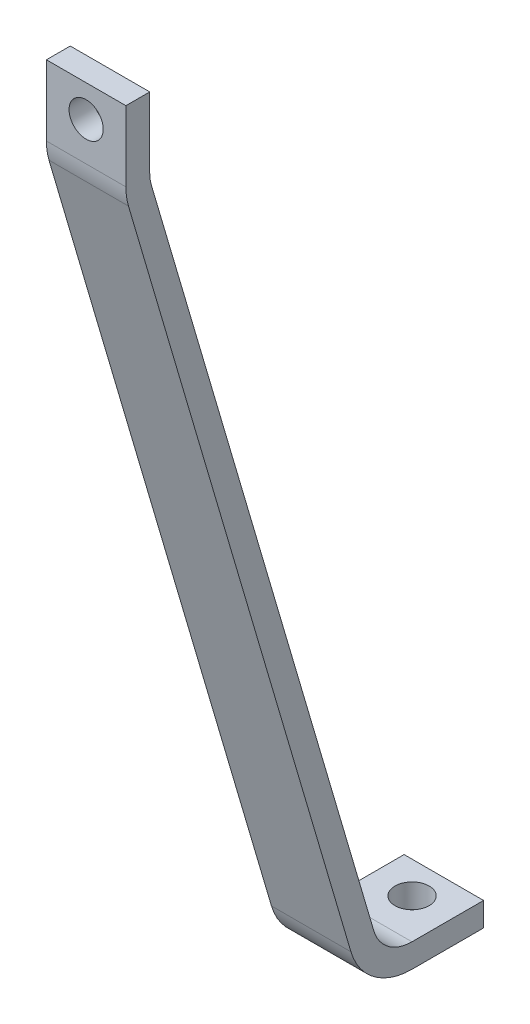
ISO-10303-21;
HEADER;
FILE_DESCRIPTION(('STEP AP214'),'2;1');
FILE_NAME('part.step','',(''),(''),'','','');
FILE_SCHEMA(('AUTOMOTIVE_DESIGN { 1 0 10303 214 1 1 1 1 }'));
ENDSEC;
DATA;
#1=APPLICATION_CONTEXT('core data for automotive mechanical design processes');
#2=APPLICATION_PROTOCOL_DEFINITION('international standard','automotive_design',2000,#1);
#3=PRODUCT_CONTEXT('',#1,'mechanical');
#4=PRODUCT('Part','Part','',(#3));
#5=PRODUCT_RELATED_PRODUCT_CATEGORY('part','',(#4));
#6=PRODUCT_DEFINITION_FORMATION('','',#4);
#7=PRODUCT_DEFINITION_CONTEXT('part definition',#1,'design');
#8=PRODUCT_DEFINITION('design','',#6,#7);
#9=PRODUCT_DEFINITION_SHAPE('','',#8);
#10=(LENGTH_UNIT() NAMED_UNIT(*) SI_UNIT(.MILLI.,.METRE.));
#11=(NAMED_UNIT(*) PLANE_ANGLE_UNIT() SI_UNIT($,.RADIAN.));
#12=(NAMED_UNIT(*) SI_UNIT($,.STERADIAN.) SOLID_ANGLE_UNIT());
#13=UNCERTAINTY_MEASURE_WITH_UNIT(LENGTH_MEASURE(1.E-05),#10,'distance_accuracy_value','');
#14=(GEOMETRIC_REPRESENTATION_CONTEXT(3) GLOBAL_UNCERTAINTY_ASSIGNED_CONTEXT((#13)) GLOBAL_UNIT_ASSIGNED_CONTEXT((#10,
#11,#12)) REPRESENTATION_CONTEXT('',''));
#15=CARTESIAN_POINT('',(0.,0.,0.));
#16=DIRECTION('',(0.,0.,1.));
#17=DIRECTION('',(1.,0.,0.));
#18=AXIS2_PLACEMENT_3D('',#15,#16,#17);
#19=CARTESIAN_POINT('',(5.,0.,-35.9873928342079));
#20=DIRECTION('',(0.,1.,0.));
#21=DIRECTION('',(0.,0.,1.));
#22=AXIS2_PLACEMENT_3D('',#19,#20,#21);
#23=PLANE('',#22);
#24=CARTESIAN_POINT('',(0.,0.,-41.));
#25=DIRECTION('',(0.,-1.,0.));
#26=DIRECTION('',(0.,0.,-1.));
#27=AXIS2_PLACEMENT_3D('',#24,#25,#26);
#28=CIRCLE('',#27,2.14999999999999);
#29=CARTESIAN_POINT('',(0.,0.,-43.15));
#30=VERTEX_POINT('',#29);
#31=EDGE_CURVE('E315',#30,#30,#28,.T.);
#32=ORIENTED_EDGE('',*,*,#31,.F.);
#33=EDGE_LOOP('',(#32));
#34=FACE_BOUND('',#33,.T.);
#35=DIRECTION('',(0.,0.,-1.));
#36=VECTOR('',#35,1.);
#37=CARTESIAN_POINT('',(-5.,0.,-35.9873928342079));
#38=LINE('',#37,#36);
#39=CARTESIAN_POINT('',(-5.,0.,-35.9873928342079));
#40=VERTEX_POINT('',#39);
#41=CARTESIAN_POINT('',(-5.,0.,-45.));
#42=VERTEX_POINT('',#41);
#43=EDGE_CURVE('E188',#40,#42,#38,.T.);
#44=ORIENTED_EDGE('',*,*,#43,.T.);
#45=DIRECTION('',(-1.,0.,0.));
#46=VECTOR('',#45,1.);
#47=CARTESIAN_POINT('',(5.,0.,-45.));
#48=LINE('',#47,#46);
#49=CARTESIAN_POINT('',(5.,0.,-45.));
#50=VERTEX_POINT('',#49);
#51=EDGE_CURVE('E11',#50,#42,#48,.T.);
#52=ORIENTED_EDGE('',*,*,#51,.F.);
#53=DIRECTION('',(0.,0.,-1.));
#54=VECTOR('',#53,1.);
#55=CARTESIAN_POINT('',(5.,0.,-35.9873928342079));
#56=LINE('',#55,#54);
#57=CARTESIAN_POINT('',(5.,0.,-35.9873928342079));
#58=VERTEX_POINT('',#57);
#59=EDGE_CURVE('E123',#58,#50,#56,.T.);
#60=ORIENTED_EDGE('',*,*,#59,.F.);
#61=DIRECTION('',(-1.,0.,0.));
#62=VECTOR('',#61,1.);
#63=CARTESIAN_POINT('',(5.,0.,-35.9873928342079));
#64=LINE('',#63,#62);
#65=EDGE_CURVE('E184',#58,#40,#64,.T.);
#66=ORIENTED_EDGE('',*,*,#65,.T.);
#67=EDGE_LOOP('',(#44,#52,#60,#66));
#68=FACE_BOUND('',#67,.T.);
#69=ADVANCED_FACE('F40',(#34,#68),#23,.F.);
#70=CARTESIAN_POINT('',(5.,3.,-45.));
#71=DIRECTION('',(0.,0.,-1.));
#72=DIRECTION('',(-1.,0.,0.));
#73=AXIS2_PLACEMENT_3D('',#70,#71,#72);
#74=PLANE('',#73);
#75=DIRECTION('',(0.,-1.,0.));
#76=VECTOR('',#75,1.);
#77=CARTESIAN_POINT('',(-5.,2.99999999999999,-45.));
#78=LINE('',#77,#76);
#79=CARTESIAN_POINT('',(-5.,2.99999999999999,-45.));
#80=VERTEX_POINT('',#79);
#81=EDGE_CURVE('E192',#80,#42,#78,.T.);
#82=ORIENTED_EDGE('',*,*,#81,.F.);
#83=DIRECTION('',(-1.,0.,0.));
#84=VECTOR('',#83,1.);
#85=CARTESIAN_POINT('',(5.,3.,-45.));
#86=LINE('',#85,#84);
#87=CARTESIAN_POINT('',(5.,3.,-45.));
#88=VERTEX_POINT('',#87);
#89=EDGE_CURVE('E49',#88,#80,#86,.T.);
#90=ORIENTED_EDGE('',*,*,#89,.F.);
#91=DIRECTION('',(0.,-1.,0.));
#92=VECTOR('',#91,1.);
#93=CARTESIAN_POINT('',(5.,3.,-45.));
#94=LINE('',#93,#92);
#95=EDGE_CURVE('E276',#88,#50,#94,.T.);
#96=ORIENTED_EDGE('',*,*,#95,.T.);
#97=ORIENTED_EDGE('',*,*,#51,.T.);
#98=EDGE_LOOP('',(#82,#90,#96,#97));
#99=FACE_BOUND('',#98,.T.);
#100=ADVANCED_FACE('F263',(#99),#74,.T.);
#101=CARTESIAN_POINT('',(5.,2.99999999999999,-35.9873928342079));
#102=DIRECTION('',(0.,1.,0.));
#103=DIRECTION('',(0.,0.,1.));
#104=AXIS2_PLACEMENT_3D('',#101,#102,#103);
#105=PLANE('',#104);
#106=CARTESIAN_POINT('',(0.,3.,-41.));
#107=DIRECTION('',(0.,1.,0.));
#108=DIRECTION('',(0.,0.,1.));
#109=AXIS2_PLACEMENT_3D('',#106,#107,#108);
#110=CIRCLE('',#109,2.14999999999999);
#111=CARTESIAN_POINT('',(0.,3.,-38.85));
#112=VERTEX_POINT('',#111);
#113=EDGE_CURVE('E303',#112,#112,#110,.T.);
#114=ORIENTED_EDGE('',*,*,#113,.F.);
#115=EDGE_LOOP('',(#114));
#116=FACE_BOUND('',#115,.T.);
#117=DIRECTION('',(0.,0.,-1.));
#118=VECTOR('',#117,1.);
#119=CARTESIAN_POINT('',(-5.,2.99999999999999,-35.9873928342079));
#120=LINE('',#119,#118);
#121=CARTESIAN_POINT('',(-5.,2.99999999999999,-35.9873928342079));
#122=VERTEX_POINT('',#121);
#123=EDGE_CURVE('E197',#122,#80,#120,.T.);
#124=ORIENTED_EDGE('',*,*,#123,.F.);
#125=DIRECTION('',(-1.,0.,0.));
#126=VECTOR('',#125,1.);
#127=CARTESIAN_POINT('',(5.,2.99999999999999,-35.9873928342079));
#128=LINE('',#127,#126);
#129=CARTESIAN_POINT('',(5.,2.99999999999999,-35.9873928342079));
#130=VERTEX_POINT('',#129);
#131=EDGE_CURVE('E250',#130,#122,#128,.T.);
#132=ORIENTED_EDGE('',*,*,#131,.F.);
#133=DIRECTION('',(0.,0.,-1.));
#134=VECTOR('',#133,1.);
#135=CARTESIAN_POINT('',(5.,2.99999999999999,-35.9873928342079));
#136=LINE('',#135,#134);
#137=EDGE_CURVE('E260',#130,#88,#136,.T.);
#138=ORIENTED_EDGE('',*,*,#137,.T.);
#139=ORIENTED_EDGE('',*,*,#89,.T.);
#140=EDGE_LOOP('',(#124,#132,#138,#139));
#141=FACE_BOUND('',#140,.T.);
#142=ADVANCED_FACE('F258',(#116,#141),#105,.T.);
#143=CARTESIAN_POINT('',(5.,7.99999999999999,-35.9873928342079));
#144=DIRECTION('',(-1.,0.,0.));
#145=DIRECTION('',(0.,0.,1.));
#146=AXIS2_PLACEMENT_3D('',#143,#144,#145);
#147=CYLINDRICAL_SURFACE('',#146,5.);
#148=CARTESIAN_POINT('',(-4.99999999999999,7.99999999999998,-35.9873928342079));
#149=DIRECTION('',(1.,0.,0.));
#150=DIRECTION('',(0.,0.,-1.));
#151=AXIS2_PLACEMENT_3D('',#148,#149,#150);
#152=CIRCLE('',#151,5.);
#153=CARTESIAN_POINT('',(-4.99999999999999,6.59031322954158,-31.1902287543379));
#154=VERTEX_POINT('',#153);
#155=EDGE_CURVE('E201',#154,#122,#152,.T.);
#156=ORIENTED_EDGE('',*,*,#155,.F.);
#157=DIRECTION('',(-1.,0.,0.));
#158=VECTOR('',#157,1.);
#159=CARTESIAN_POINT('',(5.,6.59031322954159,-31.1902287543379));
#160=LINE('',#159,#158);
#161=CARTESIAN_POINT('',(5.,6.59031322954159,-31.1902287543379));
#162=VERTEX_POINT('',#161);
#163=EDGE_CURVE('E247',#162,#154,#160,.T.);
#164=ORIENTED_EDGE('',*,*,#163,.F.);
#165=CARTESIAN_POINT('',(5.,7.99999999999999,-35.9873928342079));
#166=DIRECTION('',(1.,0.,0.));
#167=DIRECTION('',(0.,0.,-1.));
#168=AXIS2_PLACEMENT_3D('',#165,#166,#167);
#169=CIRCLE('',#168,5.);
#170=EDGE_CURVE('E273',#162,#130,#169,.T.);
#171=ORIENTED_EDGE('',*,*,#170,.T.);
#172=ORIENTED_EDGE('',*,*,#131,.T.);
#173=EDGE_LOOP('',(#156,#164,#171,#172));
#174=FACE_BOUND('',#173,.T.);
#175=ADVANCED_FACE('F270',(#174),#147,.F.);
#176=CARTESIAN_POINT('',(5.,101.831411044351,-3.20283592013004));
#177=DIRECTION('',(0.,0.281937354091681,-0.959432815973991));
#178=DIRECTION('',(0.,0.959432815973991,0.281937354091681));
#179=AXIS2_PLACEMENT_3D('',#176,#177,#178);
#180=PLANE('',#179);
#181=DIRECTION('',(0.,-0.959432815973991,-0.281937354091681));
#182=VECTOR('',#181,1.);
#183=CARTESIAN_POINT('',(-4.99999999999999,101.831411044351,-3.20283592013004));
#184=LINE('',#183,#182);
#185=CARTESIAN_POINT('',(-4.99999999999999,101.831411044351,-3.20283592013004));
#186=VERTEX_POINT('',#185);
#187=EDGE_CURVE('E205',#186,#154,#184,.T.);
#188=ORIENTED_EDGE('',*,*,#187,.F.);
#189=DIRECTION('',(-1.,0.,0.));
#190=VECTOR('',#189,1.);
#191=CARTESIAN_POINT('',(5.,101.831411044351,-3.20283592013004));
#192=LINE('',#191,#190);
#193=CARTESIAN_POINT('',(5.,101.831411044351,-3.20283592013004));
#194=VERTEX_POINT('',#193);
#195=EDGE_CURVE('E244',#194,#186,#192,.T.);
#196=ORIENTED_EDGE('',*,*,#195,.F.);
#197=DIRECTION('',(0.,-0.959432815973991,-0.281937354091681));
#198=VECTOR('',#197,1.);
#199=CARTESIAN_POINT('',(5.,101.831411044351,-3.20283592013004));
#200=LINE('',#199,#198);
#201=EDGE_CURVE('E281',#194,#162,#200,.T.);
#202=ORIENTED_EDGE('',*,*,#201,.T.);
#203=ORIENTED_EDGE('',*,*,#163,.T.);
#204=EDGE_LOOP('',(#188,#196,#202,#203));
#205=FACE_BOUND('',#204,.T.);
#206=ADVANCED_FACE('F338',(#205),#180,.T.);
#207=CARTESIAN_POINT('',(5.,103.241097814809,-8.));
#208=DIRECTION('',(-1.,0.,0.));
#209=DIRECTION('',(0.,0.,1.));
#210=AXIS2_PLACEMENT_3D('',#207,#208,#209);
#211=CYLINDRICAL_SURFACE('',#210,5.);
#212=CARTESIAN_POINT('',(-4.99999999999999,103.241097814809,-8.));
#213=DIRECTION('',(1.,0.,0.));
#214=DIRECTION('',(0.,0.,-1.));
#215=AXIS2_PLACEMENT_3D('',#212,#213,#214);
#216=CIRCLE('',#215,5.);
#217=CARTESIAN_POINT('',(-4.99999999999999,103.241097814809,-3.));
#218=VERTEX_POINT('',#217);
#219=EDGE_CURVE('E209',#218,#186,#216,.T.);
#220=ORIENTED_EDGE('',*,*,#219,.F.);
#221=DIRECTION('',(-1.,0.,0.));
#222=VECTOR('',#221,1.);
#223=CARTESIAN_POINT('',(5.,103.241097814809,-3.));
#224=LINE('',#223,#222);
#225=CARTESIAN_POINT('',(5.,103.241097814809,-3.));
#226=VERTEX_POINT('',#225);
#227=EDGE_CURVE('E241',#226,#218,#224,.T.);
#228=ORIENTED_EDGE('',*,*,#227,.F.);
#229=CARTESIAN_POINT('',(5.,103.241097814809,-8.));
#230=DIRECTION('',(1.,0.,0.));
#231=DIRECTION('',(0.,0.,-1.));
#232=AXIS2_PLACEMENT_3D('',#229,#230,#231);
#233=CIRCLE('',#232,5.);
#234=EDGE_CURVE('E288',#226,#194,#233,.T.);
#235=ORIENTED_EDGE('',*,*,#234,.T.);
#236=ORIENTED_EDGE('',*,*,#195,.T.);
#237=EDGE_LOOP('',(#220,#228,#235,#236));
#238=FACE_BOUND('',#237,.T.);
#239=ADVANCED_FACE('F335',(#238),#211,.F.);
#240=CARTESIAN_POINT('',(5.,112.09,-3.));
#241=DIRECTION('',(0.,0.,-1.));
#242=DIRECTION('',(0.,1.,0.));
#243=AXIS2_PLACEMENT_3D('',#240,#241,#242);
#244=PLANE('',#243);
#245=CARTESIAN_POINT('',(0.,108.09,-3.));
#246=DIRECTION('',(0.,0.,-1.));
#247=DIRECTION('',(0.,1.,0.));
#248=AXIS2_PLACEMENT_3D('',#245,#246,#247);
#249=CIRCLE('',#248,2.15);
#250=CARTESIAN_POINT('',(0.,110.24,-3.));
#251=VERTEX_POINT('',#250);
#252=EDGE_CURVE('E301',#251,#251,#249,.T.);
#253=ORIENTED_EDGE('',*,*,#252,.F.);
#254=EDGE_LOOP('',(#253));
#255=FACE_BOUND('',#254,.T.);
#256=DIRECTION('',(0.,-1.,0.));
#257=VECTOR('',#256,1.);
#258=CARTESIAN_POINT('',(-4.99999999999999,112.09,-3.));
#259=LINE('',#258,#257);
#260=CARTESIAN_POINT('',(-4.99999999999999,112.09,-3.));
#261=VERTEX_POINT('',#260);
#262=EDGE_CURVE('E213',#261,#218,#259,.T.);
#263=ORIENTED_EDGE('',*,*,#262,.F.);
#264=DIRECTION('',(-1.,0.,0.));
#265=VECTOR('',#264,1.);
#266=CARTESIAN_POINT('',(5.,112.09,-3.));
#267=LINE('',#266,#265);
#268=CARTESIAN_POINT('',(5.,112.09,-3.));
#269=VERTEX_POINT('',#268);
#270=EDGE_CURVE('E238',#269,#261,#267,.T.);
#271=ORIENTED_EDGE('',*,*,#270,.F.);
#272=DIRECTION('',(0.,-1.,0.));
#273=VECTOR('',#272,1.);
#274=CARTESIAN_POINT('',(5.,112.09,-3.));
#275=LINE('',#274,#273);
#276=EDGE_CURVE('E292',#269,#226,#275,.T.);
#277=ORIENTED_EDGE('',*,*,#276,.T.);
#278=ORIENTED_EDGE('',*,*,#227,.T.);
#279=EDGE_LOOP('',(#263,#271,#277,#278));
#280=FACE_BOUND('',#279,.T.);
#281=ADVANCED_FACE('F332',(#255,#280),#244,.T.);
#282=CARTESIAN_POINT('',(5.,112.09,0.));
#283=DIRECTION('',(0.,1.,0.));
#284=DIRECTION('',(0.,0.,1.));
#285=AXIS2_PLACEMENT_3D('',#282,#283,#284);
#286=PLANE('',#285);
#287=DIRECTION('',(0.,0.,-1.));
#288=VECTOR('',#287,1.);
#289=CARTESIAN_POINT('',(-4.99999999999999,112.09,0.));
#290=LINE('',#289,#288);
#291=CARTESIAN_POINT('',(-4.99999999999999,112.09,0.));
#292=VERTEX_POINT('',#291);
#293=EDGE_CURVE('E217',#292,#261,#290,.T.);
#294=ORIENTED_EDGE('',*,*,#293,.F.);
#295=DIRECTION('',(-1.,0.,0.));
#296=VECTOR('',#295,1.);
#297=CARTESIAN_POINT('',(5.,112.09,0.));
#298=LINE('',#297,#296);
#299=CARTESIAN_POINT('',(5.,112.09,0.));
#300=VERTEX_POINT('',#299);
#301=EDGE_CURVE('E235',#300,#292,#298,.T.);
#302=ORIENTED_EDGE('',*,*,#301,.F.);
#303=DIRECTION('',(0.,0.,-1.));
#304=VECTOR('',#303,1.);
#305=CARTESIAN_POINT('',(5.,112.09,0.));
#306=LINE('',#305,#304);
#307=EDGE_CURVE('E296',#300,#269,#306,.T.);
#308=ORIENTED_EDGE('',*,*,#307,.T.);
#309=ORIENTED_EDGE('',*,*,#270,.T.);
#310=EDGE_LOOP('',(#294,#302,#308,#309));
#311=FACE_BOUND('',#310,.T.);
#312=ADVANCED_FACE('F328',(#311),#286,.T.);
#313=CARTESIAN_POINT('',(5.,112.09,0.));
#314=DIRECTION('',(0.,0.,-1.));
#315=DIRECTION('',(0.,1.,0.));
#316=AXIS2_PLACEMENT_3D('',#313,#314,#315);
#317=PLANE('',#316);
#318=CARTESIAN_POINT('',(0.,108.09,0.));
#319=DIRECTION('',(0.,0.,-1.));
#320=DIRECTION('',(0.,1.,0.));
#321=AXIS2_PLACEMENT_3D('',#318,#319,#320);
#322=CIRCLE('',#321,2.15);
#323=CARTESIAN_POINT('',(0.,110.24,0.));
#324=VERTEX_POINT('',#323);
#325=EDGE_CURVE('E193',#324,#324,#322,.T.);
#326=ORIENTED_EDGE('',*,*,#325,.T.);
#327=EDGE_LOOP('',(#326));
#328=FACE_BOUND('',#327,.T.);
#329=DIRECTION('',(0.,-1.,0.));
#330=VECTOR('',#329,1.);
#331=CARTESIAN_POINT('',(-4.99999999999999,112.09,0.));
#332=LINE('',#331,#330);
#333=CARTESIAN_POINT('',(-4.99999999999999,103.241097814809,0.));
#334=VERTEX_POINT('',#333);
#335=EDGE_CURVE('E221',#292,#334,#332,.T.);
#336=ORIENTED_EDGE('',*,*,#335,.T.);
#337=DIRECTION('',(-1.,0.,0.));
#338=VECTOR('',#337,1.);
#339=CARTESIAN_POINT('',(5.,103.241097814809,0.));
#340=LINE('',#339,#338);
#341=CARTESIAN_POINT('',(5.,103.241097814809,0.));
#342=VERTEX_POINT('',#341);
#343=EDGE_CURVE('E176',#342,#334,#340,.T.);
#344=ORIENTED_EDGE('',*,*,#343,.F.);
#345=DIRECTION('',(0.,-1.,0.));
#346=VECTOR('',#345,1.);
#347=CARTESIAN_POINT('',(5.,112.09,0.));
#348=LINE('',#347,#346);
#349=EDGE_CURVE('E165',#300,#342,#348,.T.);
#350=ORIENTED_EDGE('',*,*,#349,.F.);
#351=ORIENTED_EDGE('',*,*,#301,.T.);
#352=EDGE_LOOP('',(#336,#344,#350,#351));
#353=FACE_BOUND('',#352,.T.);
#354=ADVANCED_FACE('F385',(#328,#353),#317,.F.);
#355=CARTESIAN_POINT('',(5.,103.241097814809,-8.));
#356=DIRECTION('',(-1.,0.,0.));
#357=DIRECTION('',(0.,0.,1.));
#358=AXIS2_PLACEMENT_3D('',#355,#356,#357);
#359=CYLINDRICAL_SURFACE('',#358,8.);
#360=CARTESIAN_POINT('',(-4.99999999999999,103.241097814809,-8.));
#361=DIRECTION('',(1.,0.,0.));
#362=DIRECTION('',(0.,0.,-1.));
#363=AXIS2_PLACEMENT_3D('',#360,#361,#362);
#364=CIRCLE('',#363,8.);
#365=CARTESIAN_POINT('',(-4.99999999999999,100.985598982076,-0.324537472208078));
#366=VERTEX_POINT('',#365);
#367=EDGE_CURVE('E174',#334,#366,#364,.T.);
#368=ORIENTED_EDGE('',*,*,#367,.T.);
#369=DIRECTION('',(-1.,0.,0.));
#370=VECTOR('',#369,1.);
#371=CARTESIAN_POINT('',(5.,100.985598982076,-0.324537472208078));
#372=LINE('',#371,#370);
#373=CARTESIAN_POINT('',(5.,100.985598982076,-0.324537472208078));
#374=VERTEX_POINT('',#373);
#375=EDGE_CURVE('E171',#374,#366,#372,.T.);
#376=ORIENTED_EDGE('',*,*,#375,.F.);
#377=CARTESIAN_POINT('',(5.,103.241097814809,-8.));
#378=DIRECTION('',(1.,0.,0.));
#379=DIRECTION('',(0.,0.,-1.));
#380=AXIS2_PLACEMENT_3D('',#377,#378,#379);
#381=CIRCLE('',#380,8.);
#382=EDGE_CURVE('E158',#342,#374,#381,.T.);
#383=ORIENTED_EDGE('',*,*,#382,.F.);
#384=ORIENTED_EDGE('',*,*,#343,.T.);
#385=EDGE_LOOP('',(#368,#376,#383,#384));
#386=FACE_BOUND('',#385,.T.);
#387=ADVANCED_FACE('F172',(#386),#359,.T.);
#388=CARTESIAN_POINT('',(5.,100.985598982076,-0.324537472208085));
#389=DIRECTION('',(0.,0.281937354091681,-0.959432815973991));
#390=DIRECTION('',(0.,0.959432815973991,0.281937354091681));
#391=AXIS2_PLACEMENT_3D('',#388,#389,#390);
#392=PLANE('',#391);
#393=DIRECTION('',(0.,-0.959432815973991,-0.281937354091681));
#394=VECTOR('',#393,1.);
#395=CARTESIAN_POINT('',(-4.99999999999999,100.985598982076,-0.324537472208085));
#396=LINE('',#395,#394);
#397=CARTESIAN_POINT('',(-5.,5.74450116726653,-28.3119303064159));
#398=VERTEX_POINT('',#397);
#399=EDGE_CURVE('E108',#366,#398,#396,.T.);
#400=ORIENTED_EDGE('',*,*,#399,.T.);
#401=DIRECTION('',(-1.,0.,0.));
#402=VECTOR('',#401,1.);
#403=CARTESIAN_POINT('',(5.,5.74450116726655,-28.3119303064159));
#404=LINE('',#403,#402);
#405=CARTESIAN_POINT('',(5.,5.74450116726655,-28.3119303064159));
#406=VERTEX_POINT('',#405);
#407=EDGE_CURVE('E177',#406,#398,#404,.T.);
#408=ORIENTED_EDGE('',*,*,#407,.F.);
#409=DIRECTION('',(0.,-0.959432815973991,-0.281937354091681));
#410=VECTOR('',#409,1.);
#411=CARTESIAN_POINT('',(5.,100.985598982076,-0.324537472208085));
#412=LINE('',#411,#410);
#413=EDGE_CURVE('E162',#374,#406,#412,.T.);
#414=ORIENTED_EDGE('',*,*,#413,.F.);
#415=ORIENTED_EDGE('',*,*,#375,.T.);
#416=EDGE_LOOP('',(#400,#408,#414,#415));
#417=FACE_BOUND('',#416,.T.);
#418=ADVANCED_FACE('F179',(#417),#392,.F.);
#419=CARTESIAN_POINT('',(5.,7.99999999999999,-35.9873928342079));
#420=DIRECTION('',(-1.,0.,0.));
#421=DIRECTION('',(0.,0.,1.));
#422=AXIS2_PLACEMENT_3D('',#419,#420,#421);
#423=CYLINDRICAL_SURFACE('',#422,8.);
#424=CARTESIAN_POINT('',(-4.99999999999999,7.99999999999998,-35.9873928342079));
#425=DIRECTION('',(1.,0.,0.));
#426=DIRECTION('',(0.,0.,-1.));
#427=AXIS2_PLACEMENT_3D('',#424,#425,#426);
#428=CIRCLE('',#427,8.);
#429=EDGE_CURVE('E115',#398,#40,#428,.T.);
#430=ORIENTED_EDGE('',*,*,#429,.T.);
#431=ORIENTED_EDGE('',*,*,#65,.F.);
#432=CARTESIAN_POINT('',(5.,7.99999999999999,-35.9873928342079));
#433=DIRECTION('',(1.,0.,0.));
#434=DIRECTION('',(0.,0.,-1.));
#435=AXIS2_PLACEMENT_3D('',#432,#433,#434);
#436=CIRCLE('',#435,8.);
#437=EDGE_CURVE('E57',#406,#58,#436,.T.);
#438=ORIENTED_EDGE('',*,*,#437,.F.);
#439=ORIENTED_EDGE('',*,*,#407,.T.);
#440=EDGE_LOOP('',(#430,#431,#438,#439));
#441=FACE_BOUND('',#440,.T.);
#442=ADVANCED_FACE('F405',(#441),#423,.T.);
#443=CARTESIAN_POINT('',(5.,7.99999999999999,-35.9873928342079));
#444=DIRECTION('',(1.,0.,0.));
#445=DIRECTION('',(0.,0.,-1.));
#446=AXIS2_PLACEMENT_3D('',#443,#444,#445);
#447=PLANE('',#446);
#448=ORIENTED_EDGE('',*,*,#59,.T.);
#449=ORIENTED_EDGE('',*,*,#95,.F.);
#450=ORIENTED_EDGE('',*,*,#137,.F.);
#451=ORIENTED_EDGE('',*,*,#170,.F.);
#452=ORIENTED_EDGE('',*,*,#201,.F.);
#453=ORIENTED_EDGE('',*,*,#234,.F.);
#454=ORIENTED_EDGE('',*,*,#276,.F.);
#455=ORIENTED_EDGE('',*,*,#307,.F.);
#456=ORIENTED_EDGE('',*,*,#349,.T.);
#457=ORIENTED_EDGE('',*,*,#382,.T.);
#458=ORIENTED_EDGE('',*,*,#413,.T.);
#459=ORIENTED_EDGE('',*,*,#437,.T.);
#460=EDGE_LOOP('',(#448,#449,#450,#451,#452,#453,#454,#455,#456,#457,#458,#459));
#461=FACE_BOUND('',#460,.T.);
#462=ADVANCED_FACE('F160',(#461),#447,.T.);
#463=CARTESIAN_POINT('',(-4.99999999999999,7.99999999999998,-35.9873928342079));
#464=DIRECTION('',(1.,0.,0.));
#465=DIRECTION('',(0.,0.,-1.));
#466=AXIS2_PLACEMENT_3D('',#463,#464,#465);
#467=PLANE('',#466);
#468=ORIENTED_EDGE('',*,*,#43,.F.);
#469=ORIENTED_EDGE('',*,*,#429,.F.);
#470=ORIENTED_EDGE('',*,*,#399,.F.);
#471=ORIENTED_EDGE('',*,*,#367,.F.);
#472=ORIENTED_EDGE('',*,*,#335,.F.);
#473=ORIENTED_EDGE('',*,*,#293,.T.);
#474=ORIENTED_EDGE('',*,*,#262,.T.);
#475=ORIENTED_EDGE('',*,*,#219,.T.);
#476=ORIENTED_EDGE('',*,*,#187,.T.);
#477=ORIENTED_EDGE('',*,*,#155,.T.);
#478=ORIENTED_EDGE('',*,*,#123,.T.);
#479=ORIENTED_EDGE('',*,*,#81,.T.);
#480=EDGE_LOOP('',(#468,#469,#470,#471,#472,#473,#474,#475,#476,#477,#478,#479));
#481=FACE_BOUND('',#480,.T.);
#482=ADVANCED_FACE('F266',(#481),#467,.F.);
#483=CARTESIAN_POINT('',(0.,108.09,-3.));
#484=DIRECTION('',(0.,0.,-1.));
#485=DIRECTION('',(0.,1.,0.));
#486=AXIS2_PLACEMENT_3D('',#483,#484,#485);
#487=CYLINDRICAL_SURFACE('',#486,2.15);
#488=ORIENTED_EDGE('',*,*,#325,.F.);
#489=EDGE_LOOP('',(#488));
#490=FACE_BOUND('',#489,.T.);
#491=ORIENTED_EDGE('',*,*,#252,.T.);
#492=EDGE_LOOP('',(#491));
#493=FACE_BOUND('',#492,.T.);
#494=ADVANCED_FACE('F423',(#490,#493),#487,.F.);
#495=CARTESIAN_POINT('',(0.,0.,-41.));
#496=DIRECTION('',(0.,-1.,0.));
#497=DIRECTION('',(0.,0.,-1.));
#498=AXIS2_PLACEMENT_3D('',#495,#496,#497);
#499=CYLINDRICAL_SURFACE('',#498,2.14999999999999);
#500=ORIENTED_EDGE('',*,*,#31,.T.);
#501=EDGE_LOOP('',(#500));
#502=FACE_BOUND('',#501,.T.);
#503=ORIENTED_EDGE('',*,*,#113,.T.);
#504=EDGE_LOOP('',(#503));
#505=FACE_BOUND('',#504,.T.);
#506=ADVANCED_FACE('F319',(#502,#505),#499,.F.);
#507=CLOSED_SHELL('',(#69,#100,#142,#175,#206,#239,#281,#312,#354,#387,#418,#442,#462,#482,#494,#506));
#508=MANIFOLD_SOLID_BREP('B2',#507);
#509=ADVANCED_BREP_SHAPE_REPRESENTATION('',(#18,#508),#14);
#510=SHAPE_DEFINITION_REPRESENTATION(#9,#509);
ENDSEC;
END-ISO-10303-21;
